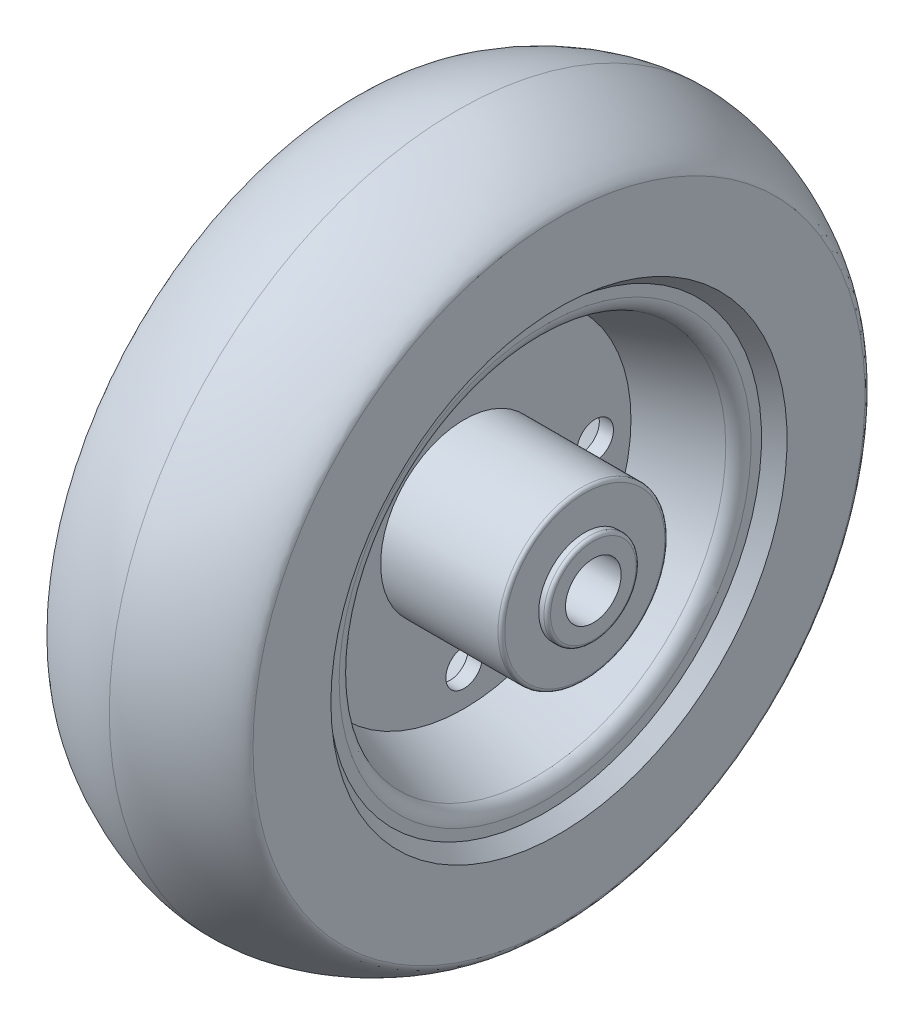
ISO-10303-21;
HEADER;
FILE_DESCRIPTION(('STEP AP214'),'2;1');
FILE_NAME('part.step','',(''),(''),'','','');
FILE_SCHEMA(('AUTOMOTIVE_DESIGN { 1 0 10303 214 1 1 1 1 }'));
ENDSEC;
DATA;
#1=APPLICATION_CONTEXT('core data for automotive mechanical design processes');
#2=APPLICATION_PROTOCOL_DEFINITION('international standard','automotive_design',2000,#1);
#3=PRODUCT_CONTEXT('',#1,'mechanical');
#4=PRODUCT('Part','Part','',(#3));
#5=PRODUCT_RELATED_PRODUCT_CATEGORY('part','',(#4));
#6=PRODUCT_DEFINITION_FORMATION('','',#4);
#7=PRODUCT_DEFINITION_CONTEXT('part definition',#1,'design');
#8=PRODUCT_DEFINITION('design','',#6,#7);
#9=PRODUCT_DEFINITION_SHAPE('','',#8);
#10=(LENGTH_UNIT() NAMED_UNIT(*) SI_UNIT(.MILLI.,.METRE.));
#11=(NAMED_UNIT(*) PLANE_ANGLE_UNIT() SI_UNIT($,.RADIAN.));
#12=(NAMED_UNIT(*) SI_UNIT($,.STERADIAN.) SOLID_ANGLE_UNIT());
#13=UNCERTAINTY_MEASURE_WITH_UNIT(LENGTH_MEASURE(1.E-05),#10,'distance_accuracy_value','');
#14=(GEOMETRIC_REPRESENTATION_CONTEXT(3) GLOBAL_UNCERTAINTY_ASSIGNED_CONTEXT((#13)) GLOBAL_UNIT_ASSIGNED_CONTEXT((#10,
#11,#12)) REPRESENTATION_CONTEXT('',''));
#15=CARTESIAN_POINT('',(0.,0.,0.));
#16=DIRECTION('',(0.,0.,1.));
#17=DIRECTION('',(1.,0.,0.));
#18=AXIS2_PLACEMENT_3D('',#15,#16,#17);
#19=CARTESIAN_POINT('',(29.1592,0.,0.));
#20=DIRECTION('',(1.,0.,0.));
#21=DIRECTION('',(0.,0.,-1.));
#22=AXIS2_PLACEMENT_3D('',#19,#20,#21);
#23=PLANE('',#22);
#24=CARTESIAN_POINT('',(29.1592,0.,0.));
#25=DIRECTION('',(1.,0.,0.));
#26=DIRECTION('',(0.,0.,-1.));
#27=AXIS2_PLACEMENT_3D('',#24,#25,#26);
#28=CIRCLE('',#27,18.288);
#29=CARTESIAN_POINT('',(29.1592,0.,-18.288));
#30=VERTEX_POINT('',#29);
#31=EDGE_CURVE('E245',#30,#30,#28,.T.);
#32=ORIENTED_EDGE('',*,*,#31,.T.);
#33=EDGE_LOOP('',(#32));
#34=FACE_BOUND('',#33,.T.);
#35=CARTESIAN_POINT('',(29.1592,0.,0.));
#36=DIRECTION('',(1.,0.,0.));
#37=DIRECTION('',(0.,0.,-1.));
#38=AXIS2_PLACEMENT_3D('',#35,#36,#37);
#39=CIRCLE('',#38,10.5156);
#40=CARTESIAN_POINT('',(29.1592,0.,-10.5156));
#41=VERTEX_POINT('',#40);
#42=EDGE_CURVE('E76',#41,#41,#39,.T.);
#43=ORIENTED_EDGE('',*,*,#42,.F.);
#44=EDGE_LOOP('',(#43));
#45=FACE_BOUND('',#44,.T.);
#46=ADVANCED_FACE('F31',(#34,#45),#23,.T.);
#47=CARTESIAN_POINT('',(1.6129,0.,0.));
#48=DIRECTION('',(1.,0.,0.));
#49=DIRECTION('',(0.,0.,-1.));
#50=AXIS2_PLACEMENT_3D('',#47,#48,#49);
#51=PLANE('',#50);
#52=CARTESIAN_POINT('',(1.6129,-4.10144979313943E-13,29.9338999999996));
#53=DIRECTION('',(1.,0.,0.));
#54=DIRECTION('',(0.,0.,-1.));
#55=AXIS2_PLACEMENT_3D('',#52,#53,#54);
#56=CIRCLE('',#55,4.1656);
#57=CARTESIAN_POINT('',(1.6129,-4.10144979313943E-13,25.7682999999996));
#58=VERTEX_POINT('',#57);
#59=EDGE_CURVE('E68',#58,#58,#56,.T.);
#60=ORIENTED_EDGE('',*,*,#59,.F.);
#61=EDGE_LOOP('',(#60));
#62=FACE_BOUND('',#61,.T.);
#63=CARTESIAN_POINT('',(1.6129,-29.9339,-8.27621649592086E-13));
#64=DIRECTION('',(1.,0.,0.));
#65=DIRECTION('',(0.,0.,-1.));
#66=AXIS2_PLACEMENT_3D('',#63,#64,#65);
#67=CIRCLE('',#66,4.1656);
#68=CARTESIAN_POINT('',(1.6129,-29.9339,-4.16560000000083));
#69=VERTEX_POINT('',#68);
#70=EDGE_CURVE('E58',#69,#69,#67,.T.);
#71=ORIENTED_EDGE('',*,*,#70,.F.);
#72=EDGE_LOOP('',(#71));
#73=FACE_BOUND('',#72,.T.);
#74=CARTESIAN_POINT('',(1.6129,4.13810824796043E-13,-29.9339000000004));
#75=DIRECTION('',(1.,0.,0.));
#76=DIRECTION('',(0.,0.,-1.));
#77=AXIS2_PLACEMENT_3D('',#74,#75,#76);
#78=CIRCLE('',#77,4.1656);
#79=CARTESIAN_POINT('',(1.6129,4.13810824796043E-13,-34.0995000000004));
#80=VERTEX_POINT('',#79);
#81=EDGE_CURVE('E55',#80,#80,#78,.T.);
#82=ORIENTED_EDGE('',*,*,#81,.F.);
#83=EDGE_LOOP('',(#82));
#84=FACE_BOUND('',#83,.T.);
#85=CARTESIAN_POINT('',(1.6129,29.9339,0.));
#86=DIRECTION('',(1.,0.,0.));
#87=DIRECTION('',(0.,0.,-1.));
#88=AXIS2_PLACEMENT_3D('',#85,#86,#87);
#89=CIRCLE('',#88,4.1656);
#90=CARTESIAN_POINT('',(1.6129,29.9339,-4.1656));
#91=VERTEX_POINT('',#90);
#92=EDGE_CURVE('E52',#91,#91,#89,.T.);
#93=ORIENTED_EDGE('',*,*,#92,.F.);
#94=EDGE_LOOP('',(#93));
#95=FACE_BOUND('',#94,.T.);
#96=CARTESIAN_POINT('',(1.61290000000003,0.,0.));
#97=DIRECTION('',(-1.,0.,0.));
#98=DIRECTION('',(0.,0.,1.));
#99=AXIS2_PLACEMENT_3D('',#96,#97,#98);
#100=CIRCLE('',#99,38.1);
#101=CARTESIAN_POINT('',(1.61290000000003,0.,38.1));
#102=VERTEX_POINT('',#101);
#103=EDGE_CURVE('E99',#102,#102,#100,.T.);
#104=ORIENTED_EDGE('',*,*,#103,.F.);
#105=EDGE_LOOP('',(#104));
#106=FACE_BOUND('',#105,.T.);
#107=CARTESIAN_POINT('',(1.6129,0.,0.));
#108=DIRECTION('',(1.,0.,0.));
#109=DIRECTION('',(0.,0.,-1.));
#110=AXIS2_PLACEMENT_3D('',#107,#108,#109);
#111=CIRCLE('',#110,19.05);
#112=CARTESIAN_POINT('',(1.6129,0.,-19.05));
#113=VERTEX_POINT('',#112);
#114=EDGE_CURVE('E81',#113,#113,#111,.T.);
#115=ORIENTED_EDGE('',*,*,#114,.F.);
#116=EDGE_LOOP('',(#115));
#117=FACE_BOUND('',#116,.T.);
#118=ADVANCED_FACE('F142',(#62,#73,#84,#95,#106,#117),#51,.T.);
#119=CARTESIAN_POINT('',(-23.2791,0.,0.));
#120=DIRECTION('',(1.,0.,0.));
#121=DIRECTION('',(0.,0.,-1.));
#122=AXIS2_PLACEMENT_3D('',#119,#120,#121);
#123=PLANE('',#122);
#124=CARTESIAN_POINT('',(-23.2791,0.,0.));
#125=DIRECTION('',(-1.,0.,0.));
#126=DIRECTION('',(0.,0.,1.));
#127=AXIS2_PLACEMENT_3D('',#124,#125,#126);
#128=CIRCLE('',#127,69.85);
#129=CARTESIAN_POINT('',(-23.2791,0.,69.85));
#130=VERTEX_POINT('',#129);
#131=EDGE_CURVE('E234',#130,#130,#128,.T.);
#132=ORIENTED_EDGE('',*,*,#131,.T.);
#133=EDGE_LOOP('',(#132));
#134=FACE_BOUND('',#133,.T.);
#135=CARTESIAN_POINT('',(-23.2791000000001,0.,0.));
#136=DIRECTION('',(-1.,0.,0.));
#137=DIRECTION('',(0.,0.,1.));
#138=AXIS2_PLACEMENT_3D('',#135,#136,#137);
#139=CIRCLE('',#138,52.07);
#140=CARTESIAN_POINT('',(-23.2791000000001,0.,52.07));
#141=VERTEX_POINT('',#140);
#142=EDGE_CURVE('E96',#141,#141,#139,.T.);
#143=ORIENTED_EDGE('',*,*,#142,.F.);
#144=EDGE_LOOP('',(#143));
#145=FACE_BOUND('',#144,.T.);
#146=ADVANCED_FACE('F139',(#134,#145),#123,.F.);
#147=CARTESIAN_POINT('',(23.2791,0.,0.));
#148=DIRECTION('',(-1.,0.,0.));
#149=DIRECTION('',(0.,0.,1.));
#150=AXIS2_PLACEMENT_3D('',#147,#148,#149);
#151=PLANE('',#150);
#152=CARTESIAN_POINT('',(23.2791,0.,0.));
#153=DIRECTION('',(-1.,0.,0.));
#154=DIRECTION('',(0.,0.,1.));
#155=AXIS2_PLACEMENT_3D('',#152,#153,#154);
#156=CIRCLE('',#155,69.85);
#157=CARTESIAN_POINT('',(23.2791,0.,69.85));
#158=VERTEX_POINT('',#157);
#159=EDGE_CURVE('E114',#158,#158,#156,.T.);
#160=ORIENTED_EDGE('',*,*,#159,.F.);
#161=EDGE_LOOP('',(#160));
#162=FACE_BOUND('',#161,.T.);
#163=CARTESIAN_POINT('',(23.2791000000001,0.,0.));
#164=DIRECTION('',(-1.,0.,0.));
#165=DIRECTION('',(0.,0.,1.));
#166=AXIS2_PLACEMENT_3D('',#163,#164,#165);
#167=CIRCLE('',#166,52.07);
#168=CARTESIAN_POINT('',(23.2791000000001,0.,52.07));
#169=VERTEX_POINT('',#168);
#170=EDGE_CURVE('E111',#169,#169,#167,.T.);
#171=ORIENTED_EDGE('',*,*,#170,.T.);
#172=EDGE_LOOP('',(#171));
#173=FACE_BOUND('',#172,.T.);
#174=ADVANCED_FACE('F134',(#162,#173),#151,.F.);
#175=CARTESIAN_POINT('',(0.,79.375,0.));
#176=CARTESIAN_POINT('',(-10.5362476671072,79.375,0.));
#177=CARTESIAN_POINT('',(-23.2791,72.0679653618574,0.));
#178=CARTESIAN_POINT('',(-23.2791,69.85,0.));
#179=B_SPLINE_CURVE_WITH_KNOTS('',3,(#175,#176,#177,#178),.UNSPECIFIED.,.F.,.F.,(4,4),(0.,1.),.UNSPECIFIED.);
#180=CARTESIAN_POINT('',(-23.2791,0.,0.));
#181=DIRECTION('',(-1.,0.,0.));
#182=AXIS1_PLACEMENT('',#180,#181);
#183=SURFACE_OF_REVOLUTION('',#179,#182);
#184=ORIENTED_EDGE('',*,*,#131,.F.);
#185=EDGE_LOOP('',(#184));
#186=FACE_BOUND('',#185,.T.);
#187=CARTESIAN_POINT('',(0.,0.,0.));
#188=DIRECTION('',(-1.,0.,0.));
#189=DIRECTION('',(0.,0.,1.));
#190=AXIS2_PLACEMENT_3D('',#187,#188,#189);
#191=CIRCLE('',#190,79.375);
#192=CARTESIAN_POINT('',(0.,0.,79.375));
#193=VERTEX_POINT('',#192);
#194=EDGE_CURVE('E232',#193,#193,#191,.T.);
#195=ORIENTED_EDGE('',*,*,#194,.T.);
#196=EDGE_LOOP('',(#195));
#197=FACE_BOUND('',#196,.T.);
#198=ADVANCED_FACE('F132',(#186,#197),#183,.T.);
#199=CARTESIAN_POINT('',(23.2791,69.85,0.));
#200=CARTESIAN_POINT('',(23.2791,72.0679653618574,0.));
#201=CARTESIAN_POINT('',(10.5362476671072,79.375,0.));
#202=CARTESIAN_POINT('',(0.,79.375,0.));
#203=B_SPLINE_CURVE_WITH_KNOTS('',3,(#199,#200,#201,#202),.UNSPECIFIED.,.F.,.F.,(4,4),(0.,1.),.UNSPECIFIED.);
#204=CARTESIAN_POINT('',(-23.2791,0.,0.));
#205=DIRECTION('',(-1.,0.,0.));
#206=AXIS1_PLACEMENT('',#204,#205);
#207=SURFACE_OF_REVOLUTION('',#203,#206);
#208=ORIENTED_EDGE('',*,*,#194,.F.);
#209=EDGE_LOOP('',(#208));
#210=FACE_BOUND('',#209,.T.);
#211=ORIENTED_EDGE('',*,*,#159,.T.);
#212=EDGE_LOOP('',(#211));
#213=FACE_BOUND('',#212,.T.);
#214=ADVANCED_FACE('F127',(#210,#213),#207,.T.);
#215=CARTESIAN_POINT('',(23.2791000000001,0.,0.));
#216=DIRECTION('',(1.,0.,0.));
#217=DIRECTION('',(0.,0.,-1.));
#218=AXIS2_PLACEMENT_3D('',#215,#216,#217);
#219=CONICAL_SURFACE('',#218,52.07,0.696844561305953);
#220=CARTESIAN_POINT('',(20.1041,0.,0.));
#221=DIRECTION('',(-1.,0.,0.));
#222=DIRECTION('',(0.,0.,1.));
#223=AXIS2_PLACEMENT_3D('',#220,#221,#222);
#224=CIRCLE('',#223,49.4128152040177);
#225=CARTESIAN_POINT('',(20.1041,0.,49.4128152040177));
#226=VERTEX_POINT('',#225);
#227=EDGE_CURVE('E108',#226,#226,#224,.T.);
#228=ORIENTED_EDGE('',*,*,#227,.T.);
#229=EDGE_LOOP('',(#228));
#230=FACE_BOUND('',#229,.T.);
#231=ORIENTED_EDGE('',*,*,#170,.F.);
#232=EDGE_LOOP('',(#231));
#233=FACE_BOUND('',#232,.T.);
#234=ADVANCED_FACE('F131',(#230,#233),#219,.F.);
#235=CARTESIAN_POINT('',(20.1041,0.,-47.0070404916489));
#236=DIRECTION('',(1.,0.,0.));
#237=DIRECTION('',(0.,0.,-1.));
#238=AXIS2_PLACEMENT_3D('',#235,#236,#237);
#239=PLANE('',#238);
#240=CARTESIAN_POINT('',(20.1041,0.,0.));
#241=DIRECTION('',(-1.,0.,0.));
#242=DIRECTION('',(0.,0.,1.));
#243=AXIS2_PLACEMENT_3D('',#240,#241,#242);
#244=CIRCLE('',#243,47.0070404916489);
#245=CARTESIAN_POINT('',(20.1041,0.,47.0070404916489));
#246=VERTEX_POINT('',#245);
#247=EDGE_CURVE('E105',#246,#246,#244,.T.);
#248=ORIENTED_EDGE('',*,*,#247,.T.);
#249=EDGE_LOOP('',(#248));
#250=FACE_BOUND('',#249,.T.);
#251=ORIENTED_EDGE('',*,*,#227,.F.);
#252=EDGE_LOOP('',(#251));
#253=FACE_BOUND('',#252,.T.);
#254=ADVANCED_FACE('F213',(#250,#253),#239,.T.);
#255=CARTESIAN_POINT('',(16.5481,0.,0.));
#256=DIRECTION('',(-1.,0.,0.));
#257=DIRECTION('',(0.,0.,1.));
#258=AXIS2_PLACEMENT_3D('',#255,#256,#257);
#259=TOROIDAL_SURFACE('',#258,47.0070404916489,3.556);
#260=CARTESIAN_POINT('',(17.7064814093755,0.,0.));
#261=DIRECTION('',(-1.,0.,0.));
#262=DIRECTION('',(0.,0.,1.));
#263=AXIS2_PLACEMENT_3D('',#260,#261,#262);
#264=CIRCLE('',#263,43.6450041280125);
#265=CARTESIAN_POINT('',(17.7064814093755,0.,43.6450041280125));
#266=VERTEX_POINT('',#265);
#267=EDGE_CURVE('E102',#266,#266,#264,.T.);
#268=ORIENTED_EDGE('',*,*,#267,.T.);
#269=EDGE_LOOP('',(#268));
#270=FACE_BOUND('',#269,.T.);
#271=ORIENTED_EDGE('',*,*,#247,.F.);
#272=EDGE_LOOP('',(#271));
#273=FACE_BOUND('',#272,.T.);
#274=ADVANCED_FACE('F209',(#270,#273),#259,.T.);
#275=CARTESIAN_POINT('',(17.7064814093755,0.,0.));
#276=DIRECTION('',(1.,0.,0.));
#277=DIRECTION('',(0.,0.,-1.));
#278=AXIS2_PLACEMENT_3D('',#275,#276,#277);
#279=CONICAL_SURFACE('',#278,43.6450041280125,0.331809173759413);
#280=ORIENTED_EDGE('',*,*,#103,.T.);
#281=EDGE_LOOP('',(#280));
#282=FACE_BOUND('',#281,.T.);
#283=ORIENTED_EDGE('',*,*,#267,.F.);
#284=EDGE_LOOP('',(#283));
#285=FACE_BOUND('',#284,.T.);
#286=ADVANCED_FACE('F204',(#282,#285),#279,.F.);
#287=CARTESIAN_POINT('',(-23.2791000000001,0.,0.));
#288=DIRECTION('',(-1.,0.,0.));
#289=DIRECTION('',(0.,0.,-1.));
#290=AXIS2_PLACEMENT_3D('',#287,#288,#289);
#291=CONICAL_SURFACE('',#290,52.07,0.696844561305953);
#292=CARTESIAN_POINT('',(-20.1041,0.,0.));
#293=DIRECTION('',(-1.,0.,0.));
#294=DIRECTION('',(0.,0.,1.));
#295=AXIS2_PLACEMENT_3D('',#292,#293,#294);
#296=CIRCLE('',#295,49.4128152040177);
#297=CARTESIAN_POINT('',(-20.1041,0.,49.4128152040177));
#298=VERTEX_POINT('',#297);
#299=EDGE_CURVE('E93',#298,#298,#296,.T.);
#300=ORIENTED_EDGE('',*,*,#299,.F.);
#301=EDGE_LOOP('',(#300));
#302=FACE_BOUND('',#301,.T.);
#303=ORIENTED_EDGE('',*,*,#142,.T.);
#304=EDGE_LOOP('',(#303));
#305=FACE_BOUND('',#304,.T.);
#306=ADVANCED_FACE('F201',(#302,#305),#291,.F.);
#307=CARTESIAN_POINT('',(-20.1041,0.,-47.0070404916489));
#308=DIRECTION('',(-1.,0.,0.));
#309=DIRECTION('',(0.,0.,-1.));
#310=AXIS2_PLACEMENT_3D('',#307,#308,#309);
#311=PLANE('',#310);
#312=CARTESIAN_POINT('',(-20.1041,0.,0.));
#313=DIRECTION('',(-1.,0.,0.));
#314=DIRECTION('',(0.,0.,1.));
#315=AXIS2_PLACEMENT_3D('',#312,#313,#314);
#316=CIRCLE('',#315,47.0070404916489);
#317=CARTESIAN_POINT('',(-20.1041,0.,47.0070404916489));
#318=VERTEX_POINT('',#317);
#319=EDGE_CURVE('E90',#318,#318,#316,.T.);
#320=ORIENTED_EDGE('',*,*,#319,.F.);
#321=EDGE_LOOP('',(#320));
#322=FACE_BOUND('',#321,.T.);
#323=ORIENTED_EDGE('',*,*,#299,.T.);
#324=EDGE_LOOP('',(#323));
#325=FACE_BOUND('',#324,.T.);
#326=ADVANCED_FACE('F197',(#322,#325),#311,.T.);
#327=CARTESIAN_POINT('',(-16.5481,0.,0.));
#328=DIRECTION('',(1.,0.,0.));
#329=DIRECTION('',(0.,0.,1.));
#330=AXIS2_PLACEMENT_3D('',#327,#328,#329);
#331=TOROIDAL_SURFACE('',#330,47.0070404916489,3.556);
#332=CARTESIAN_POINT('',(-17.7064814093755,0.,0.));
#333=DIRECTION('',(-1.,0.,0.));
#334=DIRECTION('',(0.,0.,1.));
#335=AXIS2_PLACEMENT_3D('',#332,#333,#334);
#336=CIRCLE('',#335,43.6450041280125);
#337=CARTESIAN_POINT('',(-17.7064814093755,0.,43.6450041280125));
#338=VERTEX_POINT('',#337);
#339=EDGE_CURVE('E87',#338,#338,#336,.T.);
#340=ORIENTED_EDGE('',*,*,#339,.F.);
#341=EDGE_LOOP('',(#340));
#342=FACE_BOUND('',#341,.T.);
#343=ORIENTED_EDGE('',*,*,#319,.T.);
#344=EDGE_LOOP('',(#343));
#345=FACE_BOUND('',#344,.T.);
#346=ADVANCED_FACE('F193',(#342,#345),#331,.T.);
#347=CARTESIAN_POINT('',(-17.7064814093755,0.,0.));
#348=DIRECTION('',(-1.,0.,0.));
#349=DIRECTION('',(0.,0.,-1.));
#350=AXIS2_PLACEMENT_3D('',#347,#348,#349);
#351=CONICAL_SURFACE('',#350,43.6450041280125,0.331809173759413);
#352=CARTESIAN_POINT('',(-1.61290000000003,0.,0.));
#353=DIRECTION('',(-1.,0.,0.));
#354=DIRECTION('',(0.,0.,1.));
#355=AXIS2_PLACEMENT_3D('',#352,#353,#354);
#356=CIRCLE('',#355,38.1);
#357=CARTESIAN_POINT('',(-1.61290000000003,0.,38.1));
#358=VERTEX_POINT('',#357);
#359=EDGE_CURVE('E84',#358,#358,#356,.T.);
#360=ORIENTED_EDGE('',*,*,#359,.F.);
#361=EDGE_LOOP('',(#360));
#362=FACE_BOUND('',#361,.T.);
#363=ORIENTED_EDGE('',*,*,#339,.T.);
#364=EDGE_LOOP('',(#363));
#365=FACE_BOUND('',#364,.T.);
#366=ADVANCED_FACE('F189',(#362,#365),#351,.F.);
#367=CARTESIAN_POINT('',(-1.6129,0.,0.));
#368=DIRECTION('',(-1.,0.,0.));
#369=DIRECTION('',(0.,0.,-1.));
#370=AXIS2_PLACEMENT_3D('',#367,#368,#369);
#371=PLANE('',#370);
#372=CARTESIAN_POINT('',(-1.6129,-4.10144979313943E-13,29.9338999999996));
#373=DIRECTION('',(-1.,0.,0.));
#374=DIRECTION('',(0.,0.,1.));
#375=AXIS2_PLACEMENT_3D('',#372,#373,#374);
#376=CIRCLE('',#375,4.1656);
#377=CARTESIAN_POINT('',(-1.6129,-4.10144979313943E-13,34.0994999999996));
#378=VERTEX_POINT('',#377);
#379=EDGE_CURVE('E35',#378,#378,#376,.T.);
#380=ORIENTED_EDGE('',*,*,#379,.F.);
#381=EDGE_LOOP('',(#380));
#382=FACE_BOUND('',#381,.T.);
#383=CARTESIAN_POINT('',(-1.6129,-29.9339,-8.27621649592086E-13));
#384=DIRECTION('',(-1.,0.,0.));
#385=DIRECTION('',(0.,0.,1.));
#386=AXIS2_PLACEMENT_3D('',#383,#384,#385);
#387=CIRCLE('',#386,4.1656);
#388=CARTESIAN_POINT('',(-1.6129,-29.9339,4.16559999999917));
#389=VERTEX_POINT('',#388);
#390=EDGE_CURVE('E56',#389,#389,#387,.T.);
#391=ORIENTED_EDGE('',*,*,#390,.F.);
#392=EDGE_LOOP('',(#391));
#393=FACE_BOUND('',#392,.T.);
#394=CARTESIAN_POINT('',(-1.6129,4.13810824796043E-13,-29.9339000000004));
#395=DIRECTION('',(-1.,0.,0.));
#396=DIRECTION('',(0.,0.,1.));
#397=AXIS2_PLACEMENT_3D('',#394,#395,#396);
#398=CIRCLE('',#397,4.1656);
#399=CARTESIAN_POINT('',(-1.6129,4.13810824796043E-13,-25.7683000000004));
#400=VERTEX_POINT('',#399);
#401=EDGE_CURVE('E53',#400,#400,#398,.T.);
#402=ORIENTED_EDGE('',*,*,#401,.F.);
#403=EDGE_LOOP('',(#402));
#404=FACE_BOUND('',#403,.T.);
#405=CARTESIAN_POINT('',(-1.6129,29.9339,0.));
#406=DIRECTION('',(-1.,0.,0.));
#407=DIRECTION('',(0.,0.,1.));
#408=AXIS2_PLACEMENT_3D('',#405,#406,#407);
#409=CIRCLE('',#408,4.1656);
#410=CARTESIAN_POINT('',(-1.6129,29.9339,4.1656));
#411=VERTEX_POINT('',#410);
#412=EDGE_CURVE('E48',#411,#411,#409,.T.);
#413=ORIENTED_EDGE('',*,*,#412,.F.);
#414=EDGE_LOOP('',(#413));
#415=FACE_BOUND('',#414,.T.);
#416=CARTESIAN_POINT('',(-1.6129,0.,0.));
#417=DIRECTION('',(-1.,0.,0.));
#418=DIRECTION('',(0.,0.,1.));
#419=AXIS2_PLACEMENT_3D('',#416,#417,#418);
#420=CIRCLE('',#419,19.05);
#421=CARTESIAN_POINT('',(-1.6129,0.,19.05));
#422=VERTEX_POINT('',#421);
#423=EDGE_CURVE('E250',#422,#422,#420,.T.);
#424=ORIENTED_EDGE('',*,*,#423,.F.);
#425=EDGE_LOOP('',(#424));
#426=FACE_BOUND('',#425,.T.);
#427=ORIENTED_EDGE('',*,*,#359,.T.);
#428=EDGE_LOOP('',(#427));
#429=FACE_BOUND('',#428,.T.);
#430=ADVANCED_FACE('F185',(#382,#393,#404,#415,#426,#429),#371,.T.);
#431=CARTESIAN_POINT('',(29.1592,0.,0.));
#432=DIRECTION('',(-1.,0.,0.));
#433=DIRECTION('',(0.,0.,1.));
#434=AXIS2_PLACEMENT_3D('',#431,#432,#433);
#435=CYLINDRICAL_SURFACE('',#434,19.05);
#436=CARTESIAN_POINT('',(28.3972,0.,0.));
#437=DIRECTION('',(1.,0.,0.));
#438=DIRECTION('',(0.,0.,-1.));
#439=AXIS2_PLACEMENT_3D('',#436,#437,#438);
#440=CIRCLE('',#439,19.05);
#441=CARTESIAN_POINT('',(28.3972,0.,-19.05));
#442=VERTEX_POINT('',#441);
#443=EDGE_CURVE('E247',#442,#442,#440,.F.);
#444=ORIENTED_EDGE('',*,*,#443,.T.);
#445=EDGE_LOOP('',(#444));
#446=FACE_BOUND('',#445,.T.);
#447=ORIENTED_EDGE('',*,*,#114,.T.);
#448=EDGE_LOOP('',(#447));
#449=FACE_BOUND('',#448,.T.);
#450=ADVANCED_FACE('F182',(#446,#449),#435,.T.);
#451=CARTESIAN_POINT('',(31.115,0.,0.));
#452=DIRECTION('',(-1.,0.,0.));
#453=DIRECTION('',(0.,0.,1.));
#454=AXIS2_PLACEMENT_3D('',#451,#452,#453);
#455=CYLINDRICAL_SURFACE('',#454,10.5156);
#456=CARTESIAN_POINT('',(30.353,0.,0.));
#457=DIRECTION('',(1.,0.,0.));
#458=DIRECTION('',(0.,0.,-1.));
#459=AXIS2_PLACEMENT_3D('',#456,#457,#458);
#460=CIRCLE('',#459,10.5156);
#461=CARTESIAN_POINT('',(30.353,0.,-10.5156));
#462=VERTEX_POINT('',#461);
#463=EDGE_CURVE('E242',#462,#462,#460,.F.);
#464=ORIENTED_EDGE('',*,*,#463,.T.);
#465=EDGE_LOOP('',(#464));
#466=FACE_BOUND('',#465,.T.);
#467=ORIENTED_EDGE('',*,*,#42,.T.);
#468=EDGE_LOOP('',(#467));
#469=FACE_BOUND('',#468,.T.);
#470=ADVANCED_FACE('F180',(#466,#469),#455,.T.);
#471=CARTESIAN_POINT('',(31.115,0.,0.));
#472=DIRECTION('',(1.,0.,0.));
#473=DIRECTION('',(0.,0.,-1.));
#474=AXIS2_PLACEMENT_3D('',#471,#472,#473);
#475=PLANE('',#474);
#476=CARTESIAN_POINT('',(31.115,0.,0.));
#477=DIRECTION('',(-1.,0.,0.));
#478=DIRECTION('',(0.,0.,1.));
#479=AXIS2_PLACEMENT_3D('',#476,#477,#478);
#480=CIRCLE('',#479,6.35);
#481=CARTESIAN_POINT('',(31.115,0.,6.35));
#482=VERTEX_POINT('',#481);
#483=EDGE_CURVE('E73',#482,#482,#480,.T.);
#484=ORIENTED_EDGE('',*,*,#483,.T.);
#485=EDGE_LOOP('',(#484));
#486=FACE_BOUND('',#485,.T.);
#487=CARTESIAN_POINT('',(31.115,0.,0.));
#488=DIRECTION('',(1.,0.,0.));
#489=DIRECTION('',(0.,0.,-1.));
#490=AXIS2_PLACEMENT_3D('',#487,#488,#489);
#491=CIRCLE('',#490,9.7536);
#492=CARTESIAN_POINT('',(31.115,0.,-9.7536));
#493=VERTEX_POINT('',#492);
#494=EDGE_CURVE('E239',#493,#493,#491,.T.);
#495=ORIENTED_EDGE('',*,*,#494,.T.);
#496=EDGE_LOOP('',(#495));
#497=FACE_BOUND('',#496,.T.);
#498=ADVANCED_FACE('F148',(#486,#497),#475,.T.);
#499=CARTESIAN_POINT('',(30.353,0.,0.));
#500=DIRECTION('',(1.,0.,0.));
#501=DIRECTION('',(0.,0.,-1.));
#502=AXIS2_PLACEMENT_3D('',#499,#500,#501);
#503=TOROIDAL_SURFACE('',#502,9.7536,0.762);
#504=ORIENTED_EDGE('',*,*,#463,.F.);
#505=EDGE_LOOP('',(#504));
#506=FACE_BOUND('',#505,.T.);
#507=ORIENTED_EDGE('',*,*,#494,.F.);
#508=EDGE_LOOP('',(#507));
#509=FACE_BOUND('',#508,.T.);
#510=ADVANCED_FACE('F144',(#506,#509),#503,.T.);
#511=CARTESIAN_POINT('',(28.3972,0.,0.));
#512=DIRECTION('',(1.,0.,0.));
#513=DIRECTION('',(0.,0.,-1.));
#514=AXIS2_PLACEMENT_3D('',#511,#512,#513);
#515=TOROIDAL_SURFACE('',#514,18.288,0.762);
#516=ORIENTED_EDGE('',*,*,#443,.F.);
#517=EDGE_LOOP('',(#516));
#518=FACE_BOUND('',#517,.T.);
#519=ORIENTED_EDGE('',*,*,#31,.F.);
#520=EDGE_LOOP('',(#519));
#521=FACE_BOUND('',#520,.T.);
#522=ADVANCED_FACE('F147',(#518,#521),#515,.T.);
#523=CARTESIAN_POINT('',(-29.1592,0.,0.));
#524=DIRECTION('',(1.,0.,0.));
#525=DIRECTION('',(0.,0.,-1.));
#526=AXIS2_PLACEMENT_3D('',#523,#524,#525);
#527=CYLINDRICAL_SURFACE('',#526,19.05);
#528=CARTESIAN_POINT('',(-28.3972,0.,0.));
#529=DIRECTION('',(-1.,0.,0.));
#530=DIRECTION('',(0.,0.,1.));
#531=AXIS2_PLACEMENT_3D('',#528,#529,#530);
#532=CIRCLE('',#531,19.05);
#533=CARTESIAN_POINT('',(-28.3972,0.,19.05));
#534=VERTEX_POINT('',#533);
#535=EDGE_CURVE('E39',#534,#534,#532,.F.);
#536=ORIENTED_EDGE('',*,*,#535,.T.);
#537=EDGE_LOOP('',(#536));
#538=FACE_BOUND('',#537,.T.);
#539=ORIENTED_EDGE('',*,*,#423,.T.);
#540=EDGE_LOOP('',(#539));
#541=FACE_BOUND('',#540,.T.);
#542=ADVANCED_FACE('F151',(#538,#541),#527,.T.);
#543=CARTESIAN_POINT('',(-29.1592,0.,0.));
#544=DIRECTION('',(-1.,0.,0.));
#545=DIRECTION('',(0.,0.,-1.));
#546=AXIS2_PLACEMENT_3D('',#543,#544,#545);
#547=PLANE('',#546);
#548=CARTESIAN_POINT('',(-29.1592,0.,0.));
#549=DIRECTION('',(-1.,0.,0.));
#550=DIRECTION('',(0.,0.,1.));
#551=AXIS2_PLACEMENT_3D('',#548,#549,#550);
#552=CIRCLE('',#551,18.288);
#553=CARTESIAN_POINT('',(-29.1592,0.,18.288));
#554=VERTEX_POINT('',#553);
#555=EDGE_CURVE('E10',#554,#554,#552,.T.);
#556=ORIENTED_EDGE('',*,*,#555,.T.);
#557=EDGE_LOOP('',(#556));
#558=FACE_BOUND('',#557,.T.);
#559=CARTESIAN_POINT('',(-29.1592,0.,0.));
#560=DIRECTION('',(-1.,0.,0.));
#561=DIRECTION('',(0.,0.,1.));
#562=AXIS2_PLACEMENT_3D('',#559,#560,#561);
#563=CIRCLE('',#562,10.5156);
#564=CARTESIAN_POINT('',(-29.1592,0.,10.5156));
#565=VERTEX_POINT('',#564);
#566=EDGE_CURVE('E253',#565,#565,#563,.T.);
#567=ORIENTED_EDGE('',*,*,#566,.F.);
#568=EDGE_LOOP('',(#567));
#569=FACE_BOUND('',#568,.T.);
#570=ADVANCED_FACE('F264',(#558,#569),#547,.T.);
#571=CARTESIAN_POINT('',(-31.115,0.,0.));
#572=DIRECTION('',(1.,0.,0.));
#573=DIRECTION('',(0.,0.,-1.));
#574=AXIS2_PLACEMENT_3D('',#571,#572,#573);
#575=CYLINDRICAL_SURFACE('',#574,10.5156);
#576=CARTESIAN_POINT('',(-30.353,0.,0.));
#577=DIRECTION('',(-1.,0.,0.));
#578=DIRECTION('',(0.,0.,1.));
#579=AXIS2_PLACEMENT_3D('',#576,#577,#578);
#580=CIRCLE('',#579,10.5156);
#581=CARTESIAN_POINT('',(-30.353,0.,10.5156));
#582=VERTEX_POINT('',#581);
#583=EDGE_CURVE('E256',#582,#582,#580,.F.);
#584=ORIENTED_EDGE('',*,*,#583,.T.);
#585=EDGE_LOOP('',(#584));
#586=FACE_BOUND('',#585,.T.);
#587=ORIENTED_EDGE('',*,*,#566,.T.);
#588=EDGE_LOOP('',(#587));
#589=FACE_BOUND('',#588,.T.);
#590=ADVANCED_FACE('F163',(#586,#589),#575,.T.);
#591=CARTESIAN_POINT('',(-31.115,0.,0.));
#592=DIRECTION('',(-1.,0.,0.));
#593=DIRECTION('',(0.,0.,-1.));
#594=AXIS2_PLACEMENT_3D('',#591,#592,#593);
#595=PLANE('',#594);
#596=CARTESIAN_POINT('',(-31.115,0.,0.));
#597=DIRECTION('',(-1.,0.,0.));
#598=DIRECTION('',(0.,0.,1.));
#599=AXIS2_PLACEMENT_3D('',#596,#597,#598);
#600=CIRCLE('',#599,6.35);
#601=CARTESIAN_POINT('',(-31.115,0.,6.35));
#602=VERTEX_POINT('',#601);
#603=EDGE_CURVE('E51',#602,#602,#600,.T.);
#604=ORIENTED_EDGE('',*,*,#603,.F.);
#605=EDGE_LOOP('',(#604));
#606=FACE_BOUND('',#605,.T.);
#607=CARTESIAN_POINT('',(-31.115,0.,0.));
#608=DIRECTION('',(-1.,0.,0.));
#609=DIRECTION('',(0.,0.,1.));
#610=AXIS2_PLACEMENT_3D('',#607,#608,#609);
#611=CIRCLE('',#610,9.7536);
#612=CARTESIAN_POINT('',(-31.115,0.,9.7536));
#613=VERTEX_POINT('',#612);
#614=EDGE_CURVE('E44',#613,#613,#611,.T.);
#615=ORIENTED_EDGE('',*,*,#614,.T.);
#616=EDGE_LOOP('',(#615));
#617=FACE_BOUND('',#616,.T.);
#618=ADVANCED_FACE('F155',(#606,#617),#595,.T.);
#619=CARTESIAN_POINT('',(-30.353,0.,0.));
#620=DIRECTION('',(-1.,0.,0.));
#621=DIRECTION('',(0.,0.,1.));
#622=AXIS2_PLACEMENT_3D('',#619,#620,#621);
#623=TOROIDAL_SURFACE('',#622,9.7536,0.762);
#624=ORIENTED_EDGE('',*,*,#614,.F.);
#625=EDGE_LOOP('',(#624));
#626=FACE_BOUND('',#625,.T.);
#627=ORIENTED_EDGE('',*,*,#583,.F.);
#628=EDGE_LOOP('',(#627));
#629=FACE_BOUND('',#628,.T.);
#630=ADVANCED_FACE('F153',(#626,#629),#623,.T.);
#631=CARTESIAN_POINT('',(-28.3972,0.,0.));
#632=DIRECTION('',(-1.,0.,0.));
#633=DIRECTION('',(0.,0.,1.));
#634=AXIS2_PLACEMENT_3D('',#631,#632,#633);
#635=TOROIDAL_SURFACE('',#634,18.288,0.762);
#636=ORIENTED_EDGE('',*,*,#555,.F.);
#637=EDGE_LOOP('',(#636));
#638=FACE_BOUND('',#637,.T.);
#639=ORIENTED_EDGE('',*,*,#535,.F.);
#640=EDGE_LOOP('',(#639));
#641=FACE_BOUND('',#640,.T.);
#642=ADVANCED_FACE('F33',(#638,#641),#635,.T.);
#643=CARTESIAN_POINT('',(31.115,0.,0.));
#644=DIRECTION('',(-1.,0.,0.));
#645=DIRECTION('',(0.,0.,1.));
#646=AXIS2_PLACEMENT_3D('',#643,#644,#645);
#647=CYLINDRICAL_SURFACE('',#646,6.35);
#648=CARTESIAN_POINT('',(31.115,0.,6.35));
#649=CARTESIAN_POINT('',(30.4667708333333,0.,6.35));
#650=CARTESIAN_POINT('',(29.8185416666667,0.,6.35));
#651=CARTESIAN_POINT('',(28.5220833333333,0.,6.35));
#652=CARTESIAN_POINT('',(27.8738541666667,0.,6.35));
#653=CARTESIAN_POINT('',(26.5773958333333,0.,6.35));
#654=CARTESIAN_POINT('',(25.9291666666667,0.,6.35));
#655=CARTESIAN_POINT('',(24.6327083333333,0.,6.35));
#656=CARTESIAN_POINT('',(23.9844791666667,0.,6.35));
#657=CARTESIAN_POINT('',(22.6880208333333,0.,6.35));
#658=CARTESIAN_POINT('',(22.0397916666667,0.,6.35));
#659=CARTESIAN_POINT('',(20.7433333333333,0.,6.35));
#660=CARTESIAN_POINT('',(20.0951041666667,0.,6.35));
#661=CARTESIAN_POINT('',(18.7986458333333,0.,6.35));
#662=CARTESIAN_POINT('',(18.1504166666667,0.,6.35));
#663=CARTESIAN_POINT('',(16.8539583333333,0.,6.35));
#664=CARTESIAN_POINT('',(16.2057291666667,0.,6.35));
#665=CARTESIAN_POINT('',(14.9092708333333,0.,6.35));
#666=CARTESIAN_POINT('',(14.2610416666667,0.,6.35));
#667=CARTESIAN_POINT('',(12.9645833333333,0.,6.35));
#668=CARTESIAN_POINT('',(12.3163541666667,0.,6.35));
#669=CARTESIAN_POINT('',(11.0198958333333,0.,6.35));
#670=CARTESIAN_POINT('',(10.3716666666667,0.,6.35));
#671=CARTESIAN_POINT('',(9.07520833333334,0.,6.35));
#672=CARTESIAN_POINT('',(8.42697916666667,0.,6.35));
#673=CARTESIAN_POINT('',(7.13052083333334,0.,6.35));
#674=CARTESIAN_POINT('',(6.48229166666667,0.,6.35));
#675=CARTESIAN_POINT('',(5.18583333333334,0.,6.35));
#676=CARTESIAN_POINT('',(4.53760416666667,0.,6.35));
#677=CARTESIAN_POINT('',(3.24114583333334,0.,6.35));
#678=CARTESIAN_POINT('',(2.59291666666667,0.,6.35));
#679=CARTESIAN_POINT('',(1.29645833333334,0.,6.35));
#680=CARTESIAN_POINT('',(0.64822916666667,0.,6.35));
#681=CARTESIAN_POINT('',(-0.648229166666663,0.,6.35));
#682=CARTESIAN_POINT('',(-1.29645833333333,0.,6.35));
#683=CARTESIAN_POINT('',(-2.59291666666666,0.,6.35));
#684=CARTESIAN_POINT('',(-3.24114583333333,0.,6.35));
#685=CARTESIAN_POINT('',(-4.53760416666666,0.,6.35));
#686=CARTESIAN_POINT('',(-5.18583333333333,0.,6.35));
#687=CARTESIAN_POINT('',(-6.48229166666666,0.,6.35));
#688=CARTESIAN_POINT('',(-7.13052083333333,0.,6.35));
#689=CARTESIAN_POINT('',(-8.42697916666666,0.,6.35));
#690=CARTESIAN_POINT('',(-9.07520833333333,0.,6.35));
#691=CARTESIAN_POINT('',(-10.3716666666667,0.,6.35));
#692=CARTESIAN_POINT('',(-11.0198958333333,0.,6.35));
#693=CARTESIAN_POINT('',(-12.3163541666667,0.,6.35));
#694=CARTESIAN_POINT('',(-12.9645833333333,0.,6.35));
#695=CARTESIAN_POINT('',(-14.2610416666667,0.,6.35));
#696=CARTESIAN_POINT('',(-14.9092708333333,0.,6.35));
#697=CARTESIAN_POINT('',(-16.2057291666667,0.,6.35));
#698=CARTESIAN_POINT('',(-16.8539583333333,0.,6.35));
#699=CARTESIAN_POINT('',(-18.1504166666667,0.,6.35));
#700=CARTESIAN_POINT('',(-18.7986458333333,0.,6.35));
#701=CARTESIAN_POINT('',(-20.0951041666667,0.,6.35));
#702=CARTESIAN_POINT('',(-20.7433333333333,0.,6.35));
#703=CARTESIAN_POINT('',(-22.0397916666667,0.,6.35));
#704=CARTESIAN_POINT('',(-22.6880208333333,0.,6.35));
#705=CARTESIAN_POINT('',(-23.9844791666667,0.,6.35));
#706=CARTESIAN_POINT('',(-24.6327083333333,0.,6.35));
#707=CARTESIAN_POINT('',(-25.9291666666667,0.,6.35));
#708=CARTESIAN_POINT('',(-26.5773958333333,0.,6.35));
#709=CARTESIAN_POINT('',(-27.8738541666667,0.,6.35));
#710=CARTESIAN_POINT('',(-28.5220833333333,0.,6.35));
#711=CARTESIAN_POINT('',(-29.8185416666667,0.,6.35));
#712=CARTESIAN_POINT('',(-30.4667708333333,0.,6.35));
#713=CARTESIAN_POINT('',(-31.115,0.,6.35));
#714=B_SPLINE_CURVE_WITH_KNOTS('',3,(#648,#649,#650,#651,#652,#653,#654,#655,#656,#657,#658,
#659,#660,#661,#662,#663,#664,#665,#666,#667,#668,#669,#670,#671,#672,#673,#674,#675,#676,#677,
#678,#679,#680,#681,#682,#683,#684,#685,#686,#687,#688,#689,#690,#691,#692,#693,#694,#695,#696,
#697,#698,#699,#700,#701,#702,#703,#704,#705,#706,#707,#708,#709,#710,#711,#712,#713),
.UNSPECIFIED.,.F.,.F.,(4,2,2,2,2,2,2,2,2,2,2,2,2,2,2,2,2,2,2,2,2,2,2,2,2,2,2,2,2,2,2,2,4),(0.,
1.9446875,3.889375,5.8340625,7.77875,9.7234375,11.668125,13.6128125,15.5575,17.5021875,
19.446875,21.3915625,23.33625,25.2809375,27.225625,29.1703125,31.115,33.0596875,35.004375,
36.9490625,38.89375,40.8384375,42.783125,44.7278125,46.6725,48.6171875,50.561875,52.5065625,
54.45125,56.3959375,58.340625,60.2853125,62.23),.UNSPECIFIED.);
#715=EDGE_CURVE('BSEAM161',#482,#602,#714,.T.);
#716=ORIENTED_EDGE('',*,*,#483,.F.);
#717=ORIENTED_EDGE('',*,*,#603,.T.);
#718=ORIENTED_EDGE('',*,*,#715,.T.);
#719=ORIENTED_EDGE('',*,*,#715,.F.);
#720=EDGE_LOOP('',(#716,#718,#717,#719));
#721=FACE_BOUND('',#720,.T.);
#722=ADVANCED_FACE('F161',(#721),#647,.F.);
#723=CARTESIAN_POINT('',(-31.115,29.9339,0.));
#724=DIRECTION('',(1.,0.,0.));
#725=DIRECTION('',(0.,0.,-1.));
#726=AXIS2_PLACEMENT_3D('',#723,#724,#725);
#727=CYLINDRICAL_SURFACE('',#726,4.1656);
#728=ORIENTED_EDGE('',*,*,#412,.T.);
#729=EDGE_LOOP('',(#728));
#730=FACE_BOUND('',#729,.T.);
#731=ORIENTED_EDGE('',*,*,#92,.T.);
#732=EDGE_LOOP('',(#731));
#733=FACE_BOUND('',#732,.T.);
#734=ADVANCED_FACE('F288',(#730,#733),#727,.F.);
#735=CARTESIAN_POINT('',(-31.115,4.13810824796043E-13,-29.9339000000004));
#736=DIRECTION('',(1.,0.,0.));
#737=DIRECTION('',(0.,0.,-1.));
#738=AXIS2_PLACEMENT_3D('',#735,#736,#737);
#739=CYLINDRICAL_SURFACE('',#738,4.1656);
#740=ORIENTED_EDGE('',*,*,#401,.T.);
#741=EDGE_LOOP('',(#740));
#742=FACE_BOUND('',#741,.T.);
#743=ORIENTED_EDGE('',*,*,#81,.T.);
#744=EDGE_LOOP('',(#743));
#745=FACE_BOUND('',#744,.T.);
#746=ADVANCED_FACE('F294',(#742,#745),#739,.F.);
#747=CARTESIAN_POINT('',(-31.115,-29.9339,-8.27621649592086E-13));
#748=DIRECTION('',(1.,0.,0.));
#749=DIRECTION('',(0.,0.,-1.));
#750=AXIS2_PLACEMENT_3D('',#747,#748,#749);
#751=CYLINDRICAL_SURFACE('',#750,4.1656);
#752=ORIENTED_EDGE('',*,*,#390,.T.);
#753=EDGE_LOOP('',(#752));
#754=FACE_BOUND('',#753,.T.);
#755=ORIENTED_EDGE('',*,*,#70,.T.);
#756=EDGE_LOOP('',(#755));
#757=FACE_BOUND('',#756,.T.);
#758=ADVANCED_FACE('F300',(#754,#757),#751,.F.);
#759=CARTESIAN_POINT('',(-31.115,-4.10144979313943E-13,29.9338999999996));
#760=DIRECTION('',(1.,0.,0.));
#761=DIRECTION('',(0.,0.,-1.));
#762=AXIS2_PLACEMENT_3D('',#759,#760,#761);
#763=CYLINDRICAL_SURFACE('',#762,4.1656);
#764=ORIENTED_EDGE('',*,*,#379,.T.);
#765=EDGE_LOOP('',(#764));
#766=FACE_BOUND('',#765,.T.);
#767=ORIENTED_EDGE('',*,*,#59,.T.);
#768=EDGE_LOOP('',(#767));
#769=FACE_BOUND('',#768,.T.);
#770=ADVANCED_FACE('F304',(#766,#769),#763,.F.);
#771=CLOSED_SHELL('',(#46,#118,#146,#174,#198,#214,#234,#254,#274,#286,#306,#326,#346,#366,#430,
#450,#470,#498,#510,#522,#542,#570,#590,#618,#630,#642,#722,#734,#746,#758,#770));
#772=MANIFOLD_SOLID_BREP('B2',#771);
#773=ADVANCED_BREP_SHAPE_REPRESENTATION('',(#18,#772),#14);
#774=SHAPE_DEFINITION_REPRESENTATION(#9,#773);
ENDSEC;
END-ISO-10303-21;
